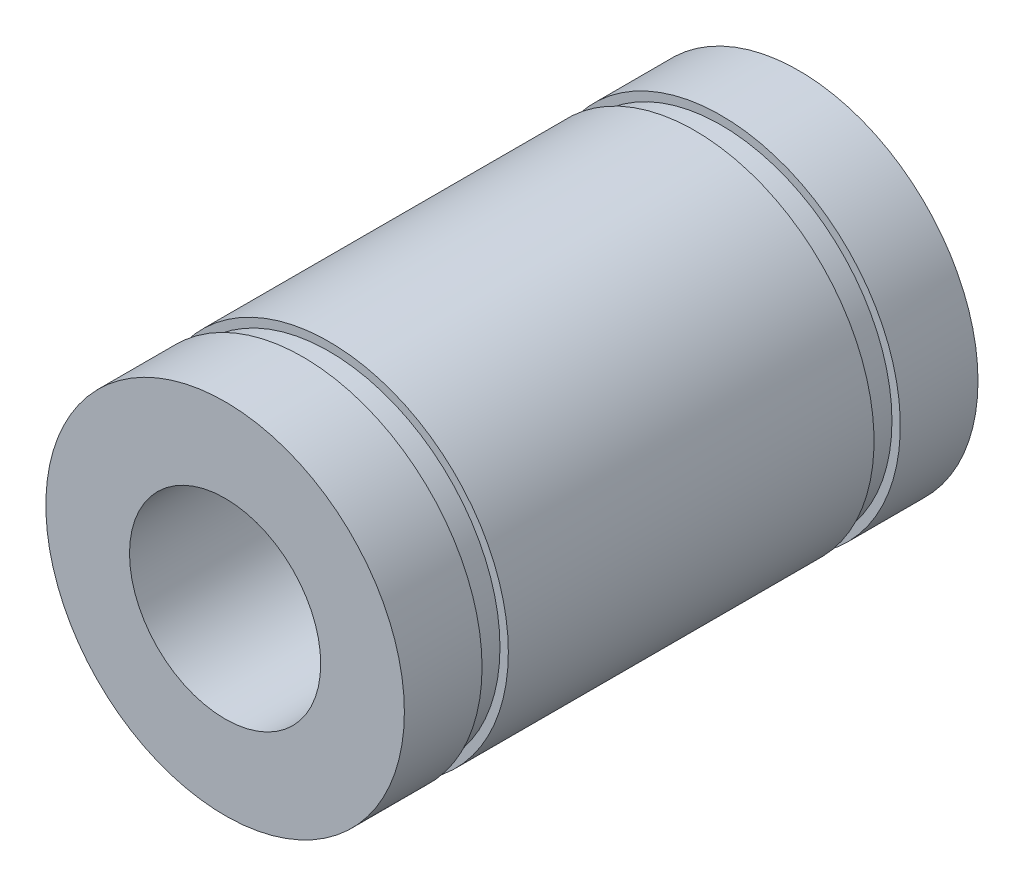
ISO-10303-21;
HEADER;
FILE_DESCRIPTION(('STEP AP214'),'2;1');
FILE_NAME('part.step','',(''),(''),'','','');
FILE_SCHEMA(('AUTOMOTIVE_DESIGN { 1 0 10303 214 1 1 1 1 }'));
ENDSEC;
DATA;
#1=APPLICATION_CONTEXT('core data for automotive mechanical design processes');
#2=APPLICATION_PROTOCOL_DEFINITION('international standard','automotive_design',2000,#1);
#3=PRODUCT_CONTEXT('',#1,'mechanical');
#4=PRODUCT('Part','Part','',(#3));
#5=PRODUCT_RELATED_PRODUCT_CATEGORY('part','',(#4));
#6=PRODUCT_DEFINITION_FORMATION('','',#4);
#7=PRODUCT_DEFINITION_CONTEXT('part definition',#1,'design');
#8=PRODUCT_DEFINITION('design','',#6,#7);
#9=PRODUCT_DEFINITION_SHAPE('','',#8);
#10=(LENGTH_UNIT() NAMED_UNIT(*) SI_UNIT(.MILLI.,.METRE.));
#11=(NAMED_UNIT(*) PLANE_ANGLE_UNIT() SI_UNIT($,.RADIAN.));
#12=(NAMED_UNIT(*) SI_UNIT($,.STERADIAN.) SOLID_ANGLE_UNIT());
#13=UNCERTAINTY_MEASURE_WITH_UNIT(LENGTH_MEASURE(1.E-05),#10,'distance_accuracy_value','');
#14=(GEOMETRIC_REPRESENTATION_CONTEXT(3) GLOBAL_UNCERTAINTY_ASSIGNED_CONTEXT((#13)) GLOBAL_UNIT_ASSIGNED_CONTEXT((#10,
#11,#12)) REPRESENTATION_CONTEXT('',''));
#15=CARTESIAN_POINT('',(0.,0.,0.));
#16=DIRECTION('',(0.,0.,1.));
#17=DIRECTION('',(1.,0.,0.));
#18=AXIS2_PLACEMENT_3D('',#15,#16,#17);
#19=CARTESIAN_POINT('',(0.,0.,12.));
#20=DIRECTION('',(0.,0.,-1.));
#21=DIRECTION('',(-1.,0.,0.));
#22=AXIS2_PLACEMENT_3D('',#19,#20,#21);
#23=CYLINDRICAL_SURFACE('',#22,7.5);
#24=CARTESIAN_POINT('',(0.,0.,7.65));
#25=DIRECTION('',(0.,0.,1.));
#26=DIRECTION('',(1.,0.,0.));
#27=AXIS2_PLACEMENT_3D('',#24,#25,#26);
#28=CIRCLE('',#27,7.5);
#29=CARTESIAN_POINT('',(7.5,0.,7.65));
#30=VERTEX_POINT('',#29);
#31=EDGE_CURVE('E55',#30,#30,#28,.T.);
#32=ORIENTED_EDGE('',*,*,#31,.F.);
#33=EDGE_LOOP('',(#32));
#34=FACE_BOUND('',#33,.T.);
#35=CARTESIAN_POINT('',(0.,0.,-7.65));
#36=DIRECTION('',(0.,0.,-1.));
#37=DIRECTION('',(-1.,0.,0.));
#38=AXIS2_PLACEMENT_3D('',#35,#36,#37);
#39=CIRCLE('',#38,7.5);
#40=CARTESIAN_POINT('',(-7.5,0.,-7.65));
#41=VERTEX_POINT('',#40);
#42=EDGE_CURVE('E37',#41,#41,#39,.T.);
#43=ORIENTED_EDGE('',*,*,#42,.F.);
#44=EDGE_LOOP('',(#43));
#45=FACE_BOUND('',#44,.T.);
#46=ADVANCED_FACE('F33',(#34,#45),#23,.T.);
#47=CARTESIAN_POINT('',(0.,0.,-8.75));
#48=DIRECTION('',(0.,0.,-1.));
#49=DIRECTION('',(-1.,0.,0.));
#50=AXIS2_PLACEMENT_3D('',#47,#48,#49);
#51=CIRCLE('',#50,7.5);
#52=CARTESIAN_POINT('',(-7.5,0.,-8.75));
#53=VERTEX_POINT('',#52);
#54=EDGE_CURVE('E58',#53,#53,#51,.T.);
#55=ORIENTED_EDGE('',*,*,#54,.T.);
#56=EDGE_LOOP('',(#55));
#57=FACE_BOUND('',#56,.T.);
#58=CARTESIAN_POINT('',(0.,0.,-12.));
#59=DIRECTION('',(0.,0.,1.));
#60=DIRECTION('',(1.,0.,0.));
#61=AXIS2_PLACEMENT_3D('',#58,#59,#60);
#62=CIRCLE('',#61,7.5);
#63=CARTESIAN_POINT('',(7.5,0.,-12.));
#64=VERTEX_POINT('',#63);
#65=EDGE_CURVE('E41',#64,#64,#62,.T.);
#66=ORIENTED_EDGE('',*,*,#65,.T.);
#67=EDGE_LOOP('',(#66));
#68=FACE_BOUND('',#67,.T.);
#69=ADVANCED_FACE('F92',(#57,#68),#23,.T.);
#70=CARTESIAN_POINT('',(0.,0.,8.75));
#71=DIRECTION('',(0.,0.,1.));
#72=DIRECTION('',(1.,0.,0.));
#73=AXIS2_PLACEMENT_3D('',#70,#71,#72);
#74=CIRCLE('',#73,7.5);
#75=CARTESIAN_POINT('',(7.5,0.,8.75));
#76=VERTEX_POINT('',#75);
#77=EDGE_CURVE('E52',#76,#76,#74,.T.);
#78=ORIENTED_EDGE('',*,*,#77,.T.);
#79=EDGE_LOOP('',(#78));
#80=FACE_BOUND('',#79,.T.);
#81=CARTESIAN_POINT('',(0.,0.,12.));
#82=DIRECTION('',(0.,0.,1.));
#83=DIRECTION('',(1.,0.,0.));
#84=AXIS2_PLACEMENT_3D('',#81,#82,#83);
#85=CIRCLE('',#84,7.5);
#86=CARTESIAN_POINT('',(7.5,0.,12.));
#87=VERTEX_POINT('',#86);
#88=EDGE_CURVE('E11',#87,#87,#85,.T.);
#89=ORIENTED_EDGE('',*,*,#88,.F.);
#90=EDGE_LOOP('',(#89));
#91=FACE_BOUND('',#90,.T.);
#92=ADVANCED_FACE('F35',(#80,#91),#23,.T.);
#93=CARTESIAN_POINT('',(0.,0.,12.));
#94=DIRECTION('',(0.,0.,1.));
#95=DIRECTION('',(1.,0.,0.));
#96=AXIS2_PLACEMENT_3D('',#93,#94,#95);
#97=PLANE('',#96);
#98=CARTESIAN_POINT('',(0.,0.,12.));
#99=DIRECTION('',(0.,0.,1.));
#100=DIRECTION('',(1.,0.,0.));
#101=AXIS2_PLACEMENT_3D('',#98,#99,#100);
#102=CIRCLE('',#101,4.);
#103=CARTESIAN_POINT('',(4.,0.,12.));
#104=VERTEX_POINT('',#103);
#105=EDGE_CURVE('E49',#104,#104,#102,.T.);
#106=ORIENTED_EDGE('',*,*,#105,.F.);
#107=EDGE_LOOP('',(#106));
#108=FACE_BOUND('',#107,.T.);
#109=ORIENTED_EDGE('',*,*,#88,.T.);
#110=EDGE_LOOP('',(#109));
#111=FACE_BOUND('',#110,.T.);
#112=ADVANCED_FACE('F84',(#108,#111),#97,.T.);
#113=CARTESIAN_POINT('',(0.,0.,-12.));
#114=DIRECTION('',(0.,0.,1.));
#115=DIRECTION('',(1.,0.,0.));
#116=AXIS2_PLACEMENT_3D('',#113,#114,#115);
#117=PLANE('',#116);
#118=CARTESIAN_POINT('',(0.,0.,-12.));
#119=DIRECTION('',(0.,0.,1.));
#120=DIRECTION('',(1.,0.,0.));
#121=AXIS2_PLACEMENT_3D('',#118,#119,#120);
#122=CIRCLE('',#121,4.);
#123=CARTESIAN_POINT('',(4.,0.,-12.));
#124=VERTEX_POINT('',#123);
#125=EDGE_CURVE('E46',#124,#124,#122,.T.);
#126=ORIENTED_EDGE('',*,*,#125,.T.);
#127=EDGE_LOOP('',(#126));
#128=FACE_BOUND('',#127,.T.);
#129=ORIENTED_EDGE('',*,*,#65,.F.);
#130=EDGE_LOOP('',(#129));
#131=FACE_BOUND('',#130,.T.);
#132=ADVANCED_FACE('F86',(#128,#131),#117,.F.);
#133=CARTESIAN_POINT('',(0.,0.,-12.));
#134=DIRECTION('',(0.,0.,1.));
#135=DIRECTION('',(1.,0.,0.));
#136=AXIS2_PLACEMENT_3D('',#133,#134,#135);
#137=CYLINDRICAL_SURFACE('',#136,4.);
#138=ORIENTED_EDGE('',*,*,#125,.F.);
#139=EDGE_LOOP('',(#138));
#140=FACE_BOUND('',#139,.T.);
#141=ORIENTED_EDGE('',*,*,#105,.T.);
#142=EDGE_LOOP('',(#141));
#143=FACE_BOUND('',#142,.T.);
#144=ADVANCED_FACE('F82',(#140,#143),#137,.F.);
#145=CARTESIAN_POINT('',(0.,0.,7.65));
#146=DIRECTION('',(0.,0.,1.));
#147=DIRECTION('',(1.,0.,0.));
#148=AXIS2_PLACEMENT_3D('',#145,#146,#147);
#149=PLANE('',#148);
#150=CARTESIAN_POINT('',(0.,0.,7.65));
#151=DIRECTION('',(0.,0.,1.));
#152=DIRECTION('',(1.,0.,0.));
#153=AXIS2_PLACEMENT_3D('',#150,#151,#152);
#154=CIRCLE('',#153,7.15);
#155=CARTESIAN_POINT('',(7.15,0.,7.65));
#156=VERTEX_POINT('',#155);
#157=EDGE_CURVE('E56',#156,#156,#154,.T.);
#158=ORIENTED_EDGE('',*,*,#157,.F.);
#159=EDGE_LOOP('',(#158));
#160=FACE_BOUND('',#159,.T.);
#161=ORIENTED_EDGE('',*,*,#31,.T.);
#162=EDGE_LOOP('',(#161));
#163=FACE_BOUND('',#162,.T.);
#164=ADVANCED_FACE('F121',(#160,#163),#149,.T.);
#165=CARTESIAN_POINT('',(0.,0.,8.75));
#166=DIRECTION('',(0.,0.,1.));
#167=DIRECTION('',(1.,0.,0.));
#168=AXIS2_PLACEMENT_3D('',#165,#166,#167);
#169=PLANE('',#168);
#170=CARTESIAN_POINT('',(0.,0.,8.75));
#171=DIRECTION('',(0.,0.,1.));
#172=DIRECTION('',(1.,0.,0.));
#173=AXIS2_PLACEMENT_3D('',#170,#171,#172);
#174=CIRCLE('',#173,7.15);
#175=CARTESIAN_POINT('',(7.15,0.,8.75));
#176=VERTEX_POINT('',#175);
#177=EDGE_CURVE('E64',#176,#176,#174,.T.);
#178=ORIENTED_EDGE('',*,*,#177,.T.);
#179=EDGE_LOOP('',(#178));
#180=FACE_BOUND('',#179,.T.);
#181=ORIENTED_EDGE('',*,*,#77,.F.);
#182=EDGE_LOOP('',(#181));
#183=FACE_BOUND('',#182,.T.);
#184=ADVANCED_FACE('F116',(#180,#183),#169,.F.);
#185=CARTESIAN_POINT('',(0.,0.,7.65));
#186=DIRECTION('',(0.,0.,1.));
#187=DIRECTION('',(1.,0.,0.));
#188=AXIS2_PLACEMENT_3D('',#185,#186,#187);
#189=CYLINDRICAL_SURFACE('',#188,7.15);
#190=ORIENTED_EDGE('',*,*,#157,.T.);
#191=EDGE_LOOP('',(#190));
#192=FACE_BOUND('',#191,.T.);
#193=ORIENTED_EDGE('',*,*,#177,.F.);
#194=EDGE_LOOP('',(#193));
#195=FACE_BOUND('',#194,.T.);
#196=ADVANCED_FACE('F107',(#192,#195),#189,.T.);
#197=CARTESIAN_POINT('',(0.,0.,-7.65));
#198=DIRECTION('',(0.,0.,-1.));
#199=DIRECTION('',(-1.,0.,0.));
#200=AXIS2_PLACEMENT_3D('',#197,#198,#199);
#201=PLANE('',#200);
#202=CARTESIAN_POINT('',(0.,0.,-7.65));
#203=DIRECTION('',(0.,0.,1.));
#204=DIRECTION('',(1.,0.,0.));
#205=AXIS2_PLACEMENT_3D('',#202,#203,#204);
#206=CIRCLE('',#205,7.15);
#207=CARTESIAN_POINT('',(7.15,0.,-7.65));
#208=VERTEX_POINT('',#207);
#209=EDGE_CURVE('E60',#208,#208,#206,.T.);
#210=ORIENTED_EDGE('',*,*,#209,.T.);
#211=EDGE_LOOP('',(#210));
#212=FACE_BOUND('',#211,.T.);
#213=ORIENTED_EDGE('',*,*,#42,.T.);
#214=EDGE_LOOP('',(#213));
#215=FACE_BOUND('',#214,.T.);
#216=ADVANCED_FACE('F104',(#212,#215),#201,.T.);
#217=CARTESIAN_POINT('',(0.,0.,-8.75));
#218=DIRECTION('',(0.,0.,-1.));
#219=DIRECTION('',(-1.,0.,0.));
#220=AXIS2_PLACEMENT_3D('',#217,#218,#219);
#221=PLANE('',#220);
#222=CARTESIAN_POINT('',(0.,0.,-8.75));
#223=DIRECTION('',(0.,0.,1.));
#224=DIRECTION('',(1.,0.,0.));
#225=AXIS2_PLACEMENT_3D('',#222,#223,#224);
#226=CIRCLE('',#225,7.15);
#227=CARTESIAN_POINT('',(7.15,0.,-8.75));
#228=VERTEX_POINT('',#227);
#229=EDGE_CURVE('E66',#228,#228,#226,.T.);
#230=ORIENTED_EDGE('',*,*,#229,.F.);
#231=EDGE_LOOP('',(#230));
#232=FACE_BOUND('',#231,.T.);
#233=ORIENTED_EDGE('',*,*,#54,.F.);
#234=EDGE_LOOP('',(#233));
#235=FACE_BOUND('',#234,.T.);
#236=ADVANCED_FACE('F106',(#232,#235),#221,.F.);
#237=CARTESIAN_POINT('',(0.,0.,-7.65));
#238=DIRECTION('',(0.,0.,-1.));
#239=DIRECTION('',(-1.,0.,0.));
#240=AXIS2_PLACEMENT_3D('',#237,#238,#239);
#241=CYLINDRICAL_SURFACE('',#240,7.15);
#242=ORIENTED_EDGE('',*,*,#209,.F.);
#243=EDGE_LOOP('',(#242));
#244=FACE_BOUND('',#243,.T.);
#245=ORIENTED_EDGE('',*,*,#229,.T.);
#246=EDGE_LOOP('',(#245));
#247=FACE_BOUND('',#246,.T.);
#248=ADVANCED_FACE('F113',(#244,#247),#241,.T.);
#249=CLOSED_SHELL('',(#46,#69,#92,#112,#132,#144,#164,#184,#196,#216,#236,#248));
#250=MANIFOLD_SOLID_BREP('B2',#249);
#251=ADVANCED_BREP_SHAPE_REPRESENTATION('',(#18,#250),#14);
#252=SHAPE_DEFINITION_REPRESENTATION(#9,#251);
ENDSEC;
END-ISO-10303-21;
